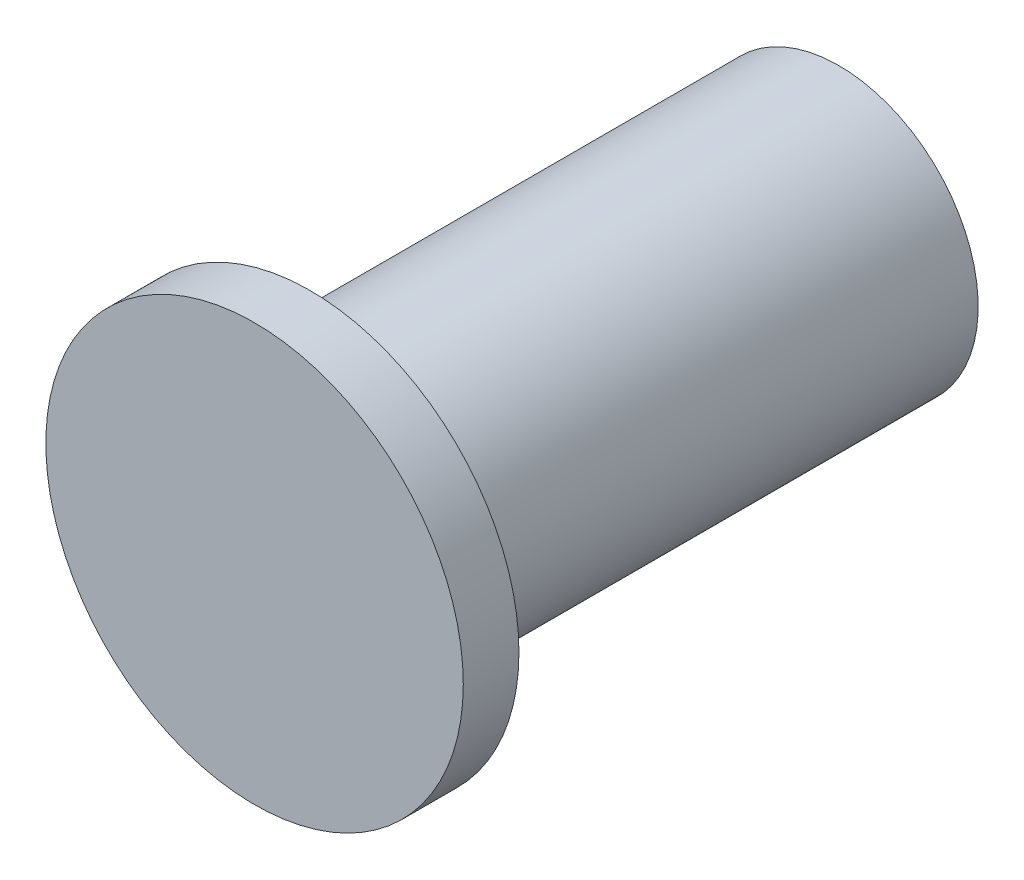
ISO-10303-21;
HEADER;
FILE_DESCRIPTION(('STEP AP214'),'2;1');
FILE_NAME('part.step','',(''),(''),'','','');
FILE_SCHEMA(('AUTOMOTIVE_DESIGN { 1 0 10303 214 1 1 1 1 }'));
ENDSEC;
DATA;
#1=APPLICATION_CONTEXT('core data for automotive mechanical design processes');
#2=APPLICATION_PROTOCOL_DEFINITION('international standard','automotive_design',2000,#1);
#3=PRODUCT_CONTEXT('',#1,'mechanical');
#4=PRODUCT('Part','Part','',(#3));
#5=PRODUCT_RELATED_PRODUCT_CATEGORY('part','',(#4));
#6=PRODUCT_DEFINITION_FORMATION('','',#4);
#7=PRODUCT_DEFINITION_CONTEXT('part definition',#1,'design');
#8=PRODUCT_DEFINITION('design','',#6,#7);
#9=PRODUCT_DEFINITION_SHAPE('','',#8);
#10=(LENGTH_UNIT() NAMED_UNIT(*) SI_UNIT(.MILLI.,.METRE.));
#11=(NAMED_UNIT(*) PLANE_ANGLE_UNIT() SI_UNIT($,.RADIAN.));
#12=(NAMED_UNIT(*) SI_UNIT($,.STERADIAN.) SOLID_ANGLE_UNIT());
#13=UNCERTAINTY_MEASURE_WITH_UNIT(LENGTH_MEASURE(1.E-05),#10,'distance_accuracy_value','');
#14=(GEOMETRIC_REPRESENTATION_CONTEXT(3) GLOBAL_UNCERTAINTY_ASSIGNED_CONTEXT((#13)) GLOBAL_UNIT_ASSIGNED_CONTEXT((#10,
#11,#12)) REPRESENTATION_CONTEXT('',''));
#15=CARTESIAN_POINT('',(0.,0.,0.));
#16=DIRECTION('',(0.,0.,1.));
#17=DIRECTION('',(1.,0.,0.));
#18=AXIS2_PLACEMENT_3D('',#15,#16,#17);
#19=CARTESIAN_POINT('',(-10.3756352144674,9.43154753752822,21.));
#20=DIRECTION('',(0.,0.,-1.));
#21=DIRECTION('',(-1.,0.,0.));
#22=AXIS2_PLACEMENT_3D('',#19,#20,#21);
#23=CYLINDRICAL_SURFACE('',#22,5.);
#24=CARTESIAN_POINT('',(-10.3756352144674,9.43154753752822,0.));
#25=DIRECTION('',(0.,0.,1.));
#26=DIRECTION('',(1.,0.,0.));
#27=AXIS2_PLACEMENT_3D('',#24,#25,#26);
#28=CIRCLE('',#27,5.);
#29=CARTESIAN_POINT('',(-15.3756352144674,9.43154753752822,0.));
#30=VERTEX_POINT('',#29);
#31=EDGE_CURVE('E41',#30,#30,#28,.T.);
#32=CARTESIAN_POINT('',(-10.3756352144674,9.43154753752822,19.));
#33=DIRECTION('',(0.,0.,1.));
#34=DIRECTION('',(1.,0.,0.));
#35=AXIS2_PLACEMENT_3D('',#32,#33,#34);
#36=CIRCLE('',#35,5.);
#37=CARTESIAN_POINT('',(-15.3756352144674,9.43154753752822,19.));
#38=VERTEX_POINT('',#37);
#39=EDGE_CURVE('E10',#38,#38,#36,.T.);
#40=CARTESIAN_POINT('',(-15.3756352144674,9.43154753752822,0.));
#41=CARTESIAN_POINT('',(-15.3756352144674,9.43154753752822,0.197916666666667));
#42=CARTESIAN_POINT('',(-15.3756352144674,9.43154753752822,0.395833333333334));
#43=CARTESIAN_POINT('',(-15.3756352144674,9.43154753752822,0.791666666666667));
#44=CARTESIAN_POINT('',(-15.3756352144674,9.43154753752822,0.989583333333334));
#45=CARTESIAN_POINT('',(-15.3756352144674,9.43154753752822,1.38541666666667));
#46=CARTESIAN_POINT('',(-15.3756352144674,9.43154753752822,1.58333333333333));
#47=CARTESIAN_POINT('',(-15.3756352144674,9.43154753752822,1.97916666666667));
#48=CARTESIAN_POINT('',(-15.3756352144674,9.43154753752822,2.17708333333334));
#49=CARTESIAN_POINT('',(-15.3756352144674,9.43154753752822,2.57291666666667));
#50=CARTESIAN_POINT('',(-15.3756352144674,9.43154753752822,2.77083333333333));
#51=CARTESIAN_POINT('',(-15.3756352144674,9.43154753752822,3.16666666666667));
#52=CARTESIAN_POINT('',(-15.3756352144674,9.43154753752822,3.36458333333333));
#53=CARTESIAN_POINT('',(-15.3756352144674,9.43154753752822,3.76041666666667));
#54=CARTESIAN_POINT('',(-15.3756352144674,9.43154753752822,3.95833333333333));
#55=CARTESIAN_POINT('',(-15.3756352144674,9.43154753752822,4.35416666666667));
#56=CARTESIAN_POINT('',(-15.3756352144674,9.43154753752822,4.55208333333333));
#57=CARTESIAN_POINT('',(-15.3756352144674,9.43154753752822,4.94791666666667));
#58=CARTESIAN_POINT('',(-15.3756352144674,9.43154753752822,5.14583333333333));
#59=CARTESIAN_POINT('',(-15.3756352144674,9.43154753752822,5.54166666666667));
#60=CARTESIAN_POINT('',(-15.3756352144674,9.43154753752822,5.73958333333333));
#61=CARTESIAN_POINT('',(-15.3756352144674,9.43154753752822,6.13541666666667));
#62=CARTESIAN_POINT('',(-15.3756352144674,9.43154753752822,6.33333333333333));
#63=CARTESIAN_POINT('',(-15.3756352144674,9.43154753752822,6.72916666666667));
#64=CARTESIAN_POINT('',(-15.3756352144674,9.43154753752822,6.92708333333333));
#65=CARTESIAN_POINT('',(-15.3756352144674,9.43154753752822,7.32291666666667));
#66=CARTESIAN_POINT('',(-15.3756352144674,9.43154753752822,7.52083333333333));
#67=CARTESIAN_POINT('',(-15.3756352144674,9.43154753752822,7.91666666666667));
#68=CARTESIAN_POINT('',(-15.3756352144674,9.43154753752822,8.11458333333333));
#69=CARTESIAN_POINT('',(-15.3756352144674,9.43154753752822,8.51041666666667));
#70=CARTESIAN_POINT('',(-15.3756352144674,9.43154753752822,8.70833333333333));
#71=CARTESIAN_POINT('',(-15.3756352144674,9.43154753752822,9.10416666666667));
#72=CARTESIAN_POINT('',(-15.3756352144674,9.43154753752822,9.30208333333333));
#73=CARTESIAN_POINT('',(-15.3756352144674,9.43154753752822,9.69791666666667));
#74=CARTESIAN_POINT('',(-15.3756352144674,9.43154753752822,9.89583333333333));
#75=CARTESIAN_POINT('',(-15.3756352144674,9.43154753752822,10.2916666666667));
#76=CARTESIAN_POINT('',(-15.3756352144674,9.43154753752822,10.4895833333333));
#77=CARTESIAN_POINT('',(-15.3756352144674,9.43154753752822,10.8854166666667));
#78=CARTESIAN_POINT('',(-15.3756352144674,9.43154753752822,11.0833333333333));
#79=CARTESIAN_POINT('',(-15.3756352144674,9.43154753752822,11.4791666666667));
#80=CARTESIAN_POINT('',(-15.3756352144674,9.43154753752822,11.6770833333333));
#81=CARTESIAN_POINT('',(-15.3756352144674,9.43154753752822,12.0729166666667));
#82=CARTESIAN_POINT('',(-15.3756352144674,9.43154753752822,12.2708333333333));
#83=CARTESIAN_POINT('',(-15.3756352144674,9.43154753752822,12.6666666666667));
#84=CARTESIAN_POINT('',(-15.3756352144674,9.43154753752822,12.8645833333333));
#85=CARTESIAN_POINT('',(-15.3756352144674,9.43154753752822,13.2604166666667));
#86=CARTESIAN_POINT('',(-15.3756352144674,9.43154753752822,13.4583333333333));
#87=CARTESIAN_POINT('',(-15.3756352144674,9.43154753752822,13.8541666666667));
#88=CARTESIAN_POINT('',(-15.3756352144674,9.43154753752822,14.0520833333333));
#89=CARTESIAN_POINT('',(-15.3756352144674,9.43154753752822,14.4479166666667));
#90=CARTESIAN_POINT('',(-15.3756352144674,9.43154753752822,14.6458333333333));
#91=CARTESIAN_POINT('',(-15.3756352144674,9.43154753752822,15.0416666666667));
#92=CARTESIAN_POINT('',(-15.3756352144674,9.43154753752822,15.2395833333333));
#93=CARTESIAN_POINT('',(-15.3756352144674,9.43154753752822,15.6354166666667));
#94=CARTESIAN_POINT('',(-15.3756352144674,9.43154753752822,15.8333333333333));
#95=CARTESIAN_POINT('',(-15.3756352144674,9.43154753752822,16.2291666666667));
#96=CARTESIAN_POINT('',(-15.3756352144674,9.43154753752822,16.4270833333333));
#97=CARTESIAN_POINT('',(-15.3756352144674,9.43154753752822,16.8229166666667));
#98=CARTESIAN_POINT('',(-15.3756352144674,9.43154753752822,17.0208333333333));
#99=CARTESIAN_POINT('',(-15.3756352144674,9.43154753752822,17.4166666666667));
#100=CARTESIAN_POINT('',(-15.3756352144674,9.43154753752822,17.6145833333333));
#101=CARTESIAN_POINT('',(-15.3756352144674,9.43154753752822,18.0104166666667));
#102=CARTESIAN_POINT('',(-15.3756352144674,9.43154753752822,18.2083333333333));
#103=CARTESIAN_POINT('',(-15.3756352144674,9.43154753752822,18.6041666666667));
#104=CARTESIAN_POINT('',(-15.3756352144674,9.43154753752822,18.8020833333333));
#105=CARTESIAN_POINT('',(-15.3756352144674,9.43154753752822,19.));
#106=B_SPLINE_CURVE_WITH_KNOTS('',3,(#40,#41,#42,#43,#44,#45,#46,#47,#48,#49,#50,#51,#52,#53,
#54,#55,#56,#57,#58,#59,#60,#61,#62,#63,#64,#65,#66,#67,#68,#69,#70,#71,#72,#73,#74,#75,#76,#77,
#78,#79,#80,#81,#82,#83,#84,#85,#86,#87,#88,#89,#90,#91,#92,#93,#94,#95,#96,#97,#98,#99,#100,
#101,#102,#103,#104,#105),.UNSPECIFIED.,.F.,.F.,(4,2,2,2,2,2,2,2,2,2,2,2,2,2,2,2,2,2,2,2,2,2,2,
2,2,2,2,2,2,2,2,2,4),(0.,0.593750000000001,1.1875,1.78125,2.375,2.96875,3.5625,4.15625,4.75,
5.34375,5.9375,6.53125,7.125,7.71875,8.3125,8.90625,9.5,10.09375,10.6875,11.28125,11.875,
12.46875,13.0625,13.65625,14.25,14.84375,15.4375,16.03125,16.625,17.21875,17.8125,18.40625,19.),.UNSPECIFIED.);
#107=EDGE_CURVE('BSEAM35',#30,#38,#106,.T.);
#108=ORIENTED_EDGE('',*,*,#31,.T.);
#109=ORIENTED_EDGE('',*,*,#39,.F.);
#110=ORIENTED_EDGE('',*,*,#107,.T.);
#111=ORIENTED_EDGE('',*,*,#107,.F.);
#112=EDGE_LOOP('',(#108,#110,#109,#111));
#113=FACE_BOUND('',#112,.T.);
#114=ADVANCED_FACE('F35',(#113),#23,.T.);
#115=CARTESIAN_POINT('',(-10.3756352144674,9.43154753752822,0.));
#116=DIRECTION('',(0.,0.,1.));
#117=DIRECTION('',(1.,0.,0.));
#118=AXIS2_PLACEMENT_3D('',#115,#116,#117);
#119=PLANE('',#118);
#120=ORIENTED_EDGE('',*,*,#31,.F.);
#121=EDGE_LOOP('',(#120));
#122=FACE_BOUND('',#121,.T.);
#123=ADVANCED_FACE('F60',(#122),#119,.F.);
#124=CARTESIAN_POINT('',(-10.3756352144674,9.43154753752822,19.));
#125=DIRECTION('',(0.,0.,1.));
#126=DIRECTION('',(1.,0.,0.));
#127=AXIS2_PLACEMENT_3D('',#124,#125,#126);
#128=CYLINDRICAL_SURFACE('',#127,7.5);
#129=CARTESIAN_POINT('',(-10.3756352144674,9.43154753752822,19.));
#130=DIRECTION('',(0.,0.,1.));
#131=DIRECTION('',(1.,0.,0.));
#132=AXIS2_PLACEMENT_3D('',#129,#130,#131);
#133=CIRCLE('',#132,7.5);
#134=CARTESIAN_POINT('',(-2.87563521446739,9.43154753752822,19.));
#135=VERTEX_POINT('',#134);
#136=EDGE_CURVE('E45',#135,#135,#133,.T.);
#137=ORIENTED_EDGE('',*,*,#136,.T.);
#138=EDGE_LOOP('',(#137));
#139=FACE_BOUND('',#138,.T.);
#140=CARTESIAN_POINT('',(-10.3756352144674,9.43154753752822,21.));
#141=DIRECTION('',(0.,0.,1.));
#142=DIRECTION('',(1.,0.,0.));
#143=AXIS2_PLACEMENT_3D('',#140,#141,#142);
#144=CIRCLE('',#143,7.5);
#145=CARTESIAN_POINT('',(-2.87563521446739,9.43154753752822,21.));
#146=VERTEX_POINT('',#145);
#147=EDGE_CURVE('E49',#146,#146,#144,.T.);
#148=ORIENTED_EDGE('',*,*,#147,.F.);
#149=EDGE_LOOP('',(#148));
#150=FACE_BOUND('',#149,.T.);
#151=ADVANCED_FACE('F57',(#139,#150),#128,.T.);
#152=CARTESIAN_POINT('',(-10.3756352144674,9.43154753752822,19.));
#153=DIRECTION('',(0.,0.,1.));
#154=DIRECTION('',(1.,0.,0.));
#155=AXIS2_PLACEMENT_3D('',#152,#153,#154);
#156=PLANE('',#155);
#157=ORIENTED_EDGE('',*,*,#39,.T.);
#158=EDGE_LOOP('',(#157));
#159=FACE_BOUND('',#158,.T.);
#160=ORIENTED_EDGE('',*,*,#136,.F.);
#161=EDGE_LOOP('',(#160));
#162=FACE_BOUND('',#161,.T.);
#163=ADVANCED_FACE('F59',(#159,#162),#156,.F.);
#164=CARTESIAN_POINT('',(-10.3756352144674,9.43154753752822,21.));
#165=DIRECTION('',(0.,0.,1.));
#166=DIRECTION('',(1.,0.,0.));
#167=AXIS2_PLACEMENT_3D('',#164,#165,#166);
#168=PLANE('',#167);
#169=ORIENTED_EDGE('',*,*,#147,.T.);
#170=EDGE_LOOP('',(#169));
#171=FACE_BOUND('',#170,.T.);
#172=ADVANCED_FACE('F55',(#171),#168,.T.);
#173=CLOSED_SHELL('',(#114,#123,#151,#163,#172));
#174=MANIFOLD_SOLID_BREP('B2',#173);
#175=ADVANCED_BREP_SHAPE_REPRESENTATION('',(#18,#174),#14);
#176=SHAPE_DEFINITION_REPRESENTATION(#9,#175);
ENDSEC;
END-ISO-10303-21;
